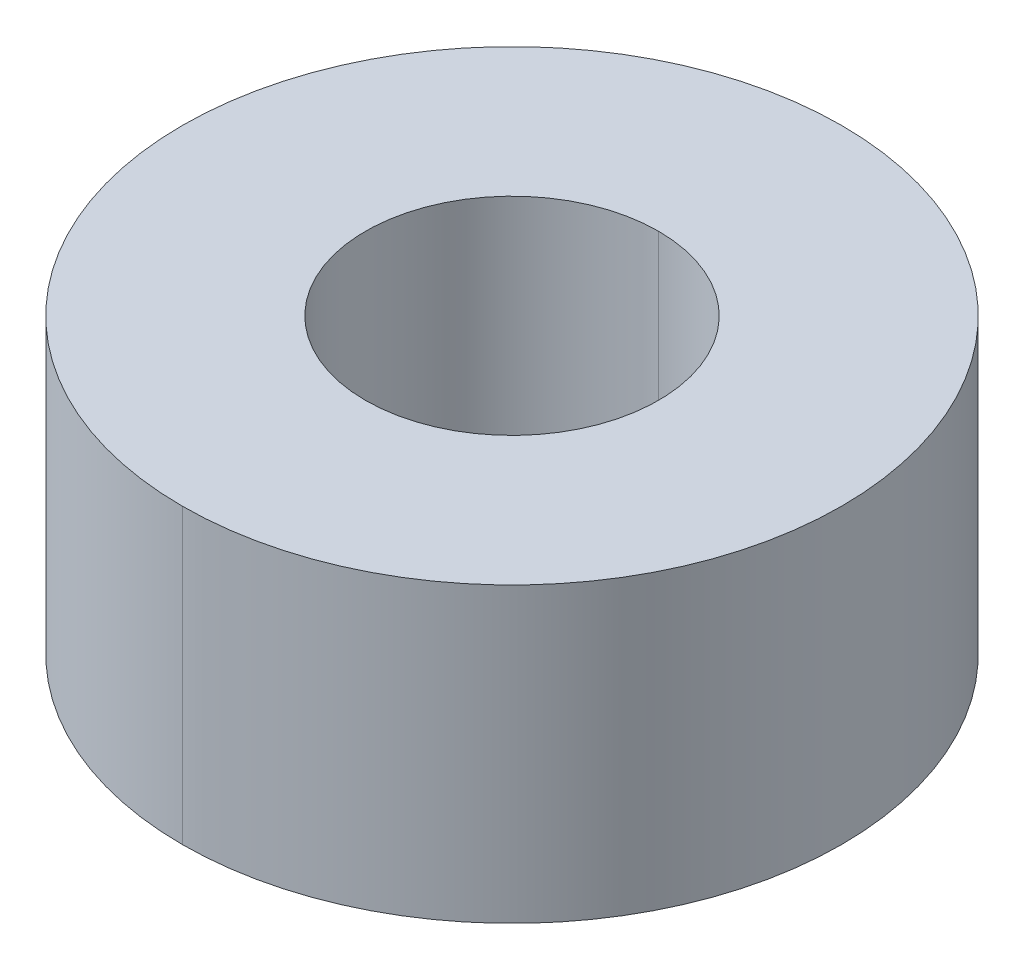
ISO-10303-21;
HEADER;
FILE_DESCRIPTION(('STEP AP214'),'2;1');
FILE_NAME('part.step','',(''),(''),'','','');
FILE_SCHEMA(('AUTOMOTIVE_DESIGN { 1 0 10303 214 1 1 1 1 }'));
ENDSEC;
DATA;
#1=APPLICATION_CONTEXT('core data for automotive mechanical design processes');
#2=APPLICATION_PROTOCOL_DEFINITION('international standard','automotive_design',2000,#1);
#3=PRODUCT_CONTEXT('',#1,'mechanical');
#4=PRODUCT('Part','Part','',(#3));
#5=PRODUCT_RELATED_PRODUCT_CATEGORY('part','',(#4));
#6=PRODUCT_DEFINITION_FORMATION('','',#4);
#7=PRODUCT_DEFINITION_CONTEXT('part definition',#1,'design');
#8=PRODUCT_DEFINITION('design','',#6,#7);
#9=PRODUCT_DEFINITION_SHAPE('','',#8);
#10=(LENGTH_UNIT() NAMED_UNIT(*) SI_UNIT(.MILLI.,.METRE.));
#11=(NAMED_UNIT(*) PLANE_ANGLE_UNIT() SI_UNIT($,.RADIAN.));
#12=(NAMED_UNIT(*) SI_UNIT($,.STERADIAN.) SOLID_ANGLE_UNIT());
#13=UNCERTAINTY_MEASURE_WITH_UNIT(LENGTH_MEASURE(1.E-05),#10,'distance_accuracy_value','');
#14=(GEOMETRIC_REPRESENTATION_CONTEXT(3) GLOBAL_UNCERTAINTY_ASSIGNED_CONTEXT((#13)) GLOBAL_UNIT_ASSIGNED_CONTEXT((#10,
#11,#12)) REPRESENTATION_CONTEXT('',''));
#15=CARTESIAN_POINT('',(0.,0.,0.));
#16=DIRECTION('',(0.,0.,1.));
#17=DIRECTION('',(1.,0.,0.));
#18=AXIS2_PLACEMENT_3D('',#15,#16,#17);
#19=CARTESIAN_POINT('',(0.,4.,0.));
#20=DIRECTION('',(0.,-1.,0.));
#21=DIRECTION('',(0.,0.,-1.));
#22=AXIS2_PLACEMENT_3D('',#19,#20,#21);
#23=CYLINDRICAL_SURFACE('',#22,2.);
#24=DIRECTION('',(0.,-1.,0.));
#25=VECTOR('',#24,1.);
#26=CARTESIAN_POINT('',(0.,4.,2.));
#27=LINE('',#26,#25);
#28=CARTESIAN_POINT('',(0.,4.,2.));
#29=VERTEX_POINT('',#28);
#30=CARTESIAN_POINT('',(0.,0.,2.));
#31=VERTEX_POINT('',#30);
#32=EDGE_CURVE('E82',#29,#31,#27,.T.);
#33=ORIENTED_EDGE('',*,*,#32,.F.);
#34=CARTESIAN_POINT('',(0.,4.,0.));
#35=DIRECTION('',(0.,1.,0.));
#36=DIRECTION('',(0.,0.,1.));
#37=AXIS2_PLACEMENT_3D('',#34,#35,#36);
#38=CIRCLE('',#37,2.);
#39=CARTESIAN_POINT('',(0.,4.,-2.));
#40=VERTEX_POINT('',#39);
#41=EDGE_CURVE('E74',#29,#40,#38,.T.);
#42=ORIENTED_EDGE('',*,*,#41,.T.);
#43=DIRECTION('',(0.,-1.,0.));
#44=VECTOR('',#43,1.);
#45=CARTESIAN_POINT('',(0.,4.,-2.));
#46=LINE('',#45,#44);
#47=CARTESIAN_POINT('',(0.,0.,-2.));
#48=VERTEX_POINT('',#47);
#49=EDGE_CURVE('E72',#40,#48,#46,.T.);
#50=ORIENTED_EDGE('',*,*,#49,.T.);
#51=CARTESIAN_POINT('',(0.,0.,0.));
#52=DIRECTION('',(0.,1.,0.));
#53=DIRECTION('',(0.,0.,1.));
#54=AXIS2_PLACEMENT_3D('',#51,#52,#53);
#55=CIRCLE('',#54,2.);
#56=EDGE_CURVE('E11',#31,#48,#55,.T.);
#57=ORIENTED_EDGE('',*,*,#56,.F.);
#58=EDGE_LOOP('',(#33,#42,#50,#57));
#59=FACE_BOUND('',#58,.T.);
#60=ADVANCED_FACE('F16',(#59),#23,.F.);
#61=CARTESIAN_POINT('',(0.,4.,0.));
#62=DIRECTION('',(0.,-1.,0.));
#63=DIRECTION('',(0.,0.,-1.));
#64=AXIS2_PLACEMENT_3D('',#61,#62,#63);
#65=CYLINDRICAL_SURFACE('',#64,4.5);
#66=DIRECTION('',(0.,-1.,0.));
#67=VECTOR('',#66,1.);
#68=CARTESIAN_POINT('',(0.,4.,4.5));
#69=LINE('',#68,#67);
#70=CARTESIAN_POINT('',(0.,4.,4.5));
#71=VERTEX_POINT('',#70);
#72=CARTESIAN_POINT('',(0.,0.,4.5));
#73=VERTEX_POINT('',#72);
#74=EDGE_CURVE('E99',#71,#73,#69,.T.);
#75=ORIENTED_EDGE('',*,*,#74,.F.);
#76=CARTESIAN_POINT('',(0.,4.,0.));
#77=DIRECTION('',(0.,1.,0.));
#78=DIRECTION('',(0.,0.,1.));
#79=AXIS2_PLACEMENT_3D('',#76,#77,#78);
#80=CIRCLE('',#79,4.5);
#81=CARTESIAN_POINT('',(0.,4.,-4.5));
#82=VERTEX_POINT('',#81);
#83=EDGE_CURVE('E95',#82,#71,#80,.T.);
#84=ORIENTED_EDGE('',*,*,#83,.F.);
#85=DIRECTION('',(0.,-1.,0.));
#86=VECTOR('',#85,1.);
#87=CARTESIAN_POINT('',(0.,4.,-4.5));
#88=LINE('',#87,#86);
#89=CARTESIAN_POINT('',(0.,0.,-4.5));
#90=VERTEX_POINT('',#89);
#91=EDGE_CURVE('E97',#82,#90,#88,.T.);
#92=ORIENTED_EDGE('',*,*,#91,.T.);
#93=CARTESIAN_POINT('',(0.,0.,0.));
#94=DIRECTION('',(0.,1.,0.));
#95=DIRECTION('',(0.,0.,1.));
#96=AXIS2_PLACEMENT_3D('',#93,#94,#95);
#97=CIRCLE('',#96,4.5);
#98=EDGE_CURVE('E26',#90,#73,#97,.T.);
#99=ORIENTED_EDGE('',*,*,#98,.T.);
#100=EDGE_LOOP('',(#75,#84,#92,#99));
#101=FACE_BOUND('',#100,.T.);
#102=ADVANCED_FACE('F18',(#101),#65,.T.);
#103=CARTESIAN_POINT('',(0.,0.,0.));
#104=DIRECTION('',(0.,1.,0.));
#105=DIRECTION('',(1.,0.,0.));
#106=AXIS2_PLACEMENT_3D('',#103,#104,#105);
#107=PLANE('',#106);
#108=CARTESIAN_POINT('',(0.,0.,0.));
#109=DIRECTION('',(0.,1.,0.));
#110=DIRECTION('',(0.,0.,1.));
#111=AXIS2_PLACEMENT_3D('',#108,#109,#110);
#112=CIRCLE('',#111,2.);
#113=EDGE_CURVE('E67',#48,#31,#112,.T.);
#114=ORIENTED_EDGE('',*,*,#113,.T.);
#115=ORIENTED_EDGE('',*,*,#56,.T.);
#116=EDGE_LOOP('',(#114,#115));
#117=FACE_BOUND('',#116,.T.);
#118=ORIENTED_EDGE('',*,*,#98,.F.);
#119=CARTESIAN_POINT('',(0.,0.,0.));
#120=DIRECTION('',(0.,1.,0.));
#121=DIRECTION('',(0.,0.,1.));
#122=AXIS2_PLACEMENT_3D('',#119,#120,#121);
#123=CIRCLE('',#122,4.5);
#124=EDGE_CURVE('E103',#73,#90,#123,.T.);
#125=ORIENTED_EDGE('',*,*,#124,.F.);
#126=EDGE_LOOP('',(#118,#125));
#127=FACE_BOUND('',#126,.T.);
#128=ADVANCED_FACE('F65',(#117,#127),#107,.F.);
#129=CARTESIAN_POINT('',(0.,4.,0.));
#130=DIRECTION('',(0.,1.,0.));
#131=DIRECTION('',(1.,0.,0.));
#132=AXIS2_PLACEMENT_3D('',#129,#130,#131);
#133=PLANE('',#132);
#134=CARTESIAN_POINT('',(0.,4.,0.));
#135=DIRECTION('',(0.,1.,0.));
#136=DIRECTION('',(0.,0.,1.));
#137=AXIS2_PLACEMENT_3D('',#134,#135,#136);
#138=CIRCLE('',#137,2.);
#139=EDGE_CURVE('E88',#40,#29,#138,.T.);
#140=ORIENTED_EDGE('',*,*,#139,.F.);
#141=ORIENTED_EDGE('',*,*,#41,.F.);
#142=EDGE_LOOP('',(#140,#141));
#143=FACE_BOUND('',#142,.T.);
#144=ORIENTED_EDGE('',*,*,#83,.T.);
#145=CARTESIAN_POINT('',(0.,4.,0.));
#146=DIRECTION('',(0.,1.,0.));
#147=DIRECTION('',(0.,0.,1.));
#148=AXIS2_PLACEMENT_3D('',#145,#146,#147);
#149=CIRCLE('',#148,4.5);
#150=EDGE_CURVE('E79',#71,#82,#149,.T.);
#151=ORIENTED_EDGE('',*,*,#150,.T.);
#152=EDGE_LOOP('',(#144,#151));
#153=FACE_BOUND('',#152,.T.);
#154=ADVANCED_FACE('F120',(#143,#153),#133,.T.);
#155=CARTESIAN_POINT('',(0.,4.,0.));
#156=DIRECTION('',(0.,-1.,0.));
#157=DIRECTION('',(0.,0.,-1.));
#158=AXIS2_PLACEMENT_3D('',#155,#156,#157);
#159=CYLINDRICAL_SURFACE('',#158,4.5);
#160=ORIENTED_EDGE('',*,*,#150,.F.);
#161=ORIENTED_EDGE('',*,*,#74,.T.);
#162=ORIENTED_EDGE('',*,*,#124,.T.);
#163=ORIENTED_EDGE('',*,*,#91,.F.);
#164=EDGE_LOOP('',(#160,#161,#162,#163));
#165=FACE_BOUND('',#164,.T.);
#166=ADVANCED_FACE('F118',(#165),#159,.T.);
#167=CARTESIAN_POINT('',(0.,4.,0.));
#168=DIRECTION('',(0.,-1.,0.));
#169=DIRECTION('',(0.,0.,-1.));
#170=AXIS2_PLACEMENT_3D('',#167,#168,#169);
#171=CYLINDRICAL_SURFACE('',#170,2.);
#172=ORIENTED_EDGE('',*,*,#139,.T.);
#173=ORIENTED_EDGE('',*,*,#32,.T.);
#174=ORIENTED_EDGE('',*,*,#113,.F.);
#175=ORIENTED_EDGE('',*,*,#49,.F.);
#176=EDGE_LOOP('',(#172,#173,#174,#175));
#177=FACE_BOUND('',#176,.T.);
#178=ADVANCED_FACE('F81',(#177),#171,.F.);
#179=CLOSED_SHELL('',(#60,#102,#128,#154,#166,#178));
#180=MANIFOLD_SOLID_BREP('B1',#179);
#181=ADVANCED_BREP_SHAPE_REPRESENTATION('',(#18,#180),#14);
#182=SHAPE_DEFINITION_REPRESENTATION(#9,#181);
ENDSEC;
END-ISO-10303-21;
